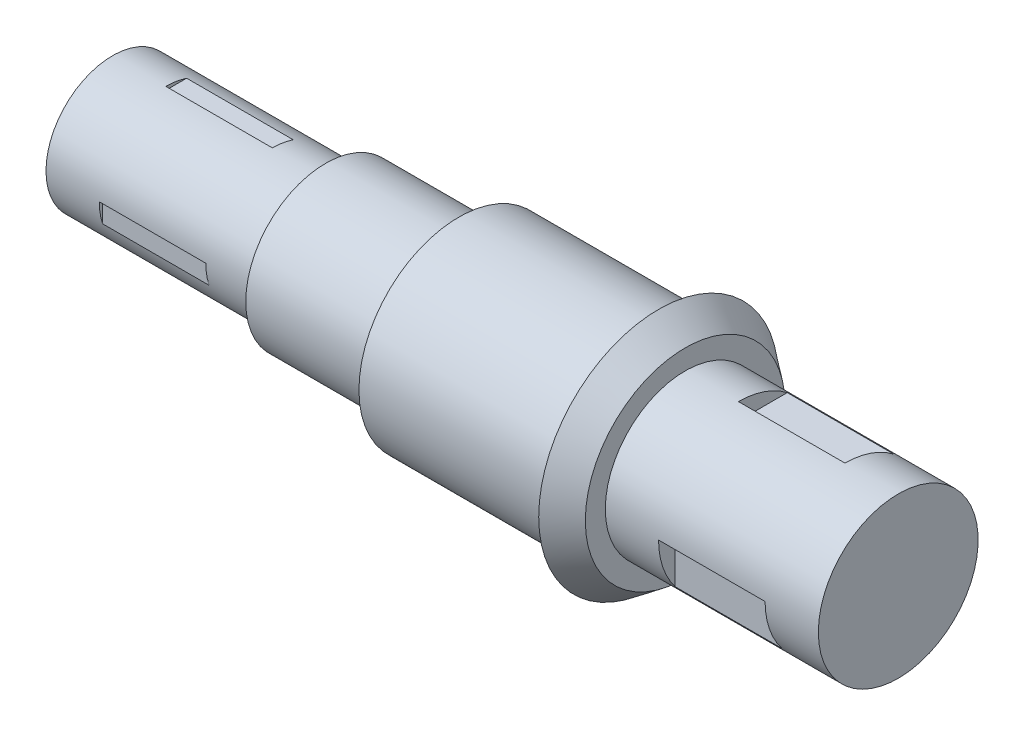
ISO-10303-21;
HEADER;
FILE_DESCRIPTION(('STEP AP214'),'2;1');
FILE_NAME('part.step','',(''),(''),'','','');
FILE_SCHEMA(('AUTOMOTIVE_DESIGN { 1 0 10303 214 1 1 1 1 }'));
ENDSEC;
DATA;
#1=APPLICATION_CONTEXT('core data for automotive mechanical design processes');
#2=APPLICATION_PROTOCOL_DEFINITION('international standard','automotive_design',2000,#1);
#3=PRODUCT_CONTEXT('',#1,'mechanical');
#4=PRODUCT('Part','Part','',(#3));
#5=PRODUCT_RELATED_PRODUCT_CATEGORY('part','',(#4));
#6=PRODUCT_DEFINITION_FORMATION('','',#4);
#7=PRODUCT_DEFINITION_CONTEXT('part definition',#1,'design');
#8=PRODUCT_DEFINITION('design','',#6,#7);
#9=PRODUCT_DEFINITION_SHAPE('','',#8);
#10=(LENGTH_UNIT() NAMED_UNIT(*) SI_UNIT(.MILLI.,.METRE.));
#11=(NAMED_UNIT(*) PLANE_ANGLE_UNIT() SI_UNIT($,.RADIAN.));
#12=(NAMED_UNIT(*) SI_UNIT($,.STERADIAN.) SOLID_ANGLE_UNIT());
#13=UNCERTAINTY_MEASURE_WITH_UNIT(LENGTH_MEASURE(1.E-05),#10,'distance_accuracy_value','');
#14=(GEOMETRIC_REPRESENTATION_CONTEXT(3) GLOBAL_UNCERTAINTY_ASSIGNED_CONTEXT((#13)) GLOBAL_UNIT_ASSIGNED_CONTEXT((#10,
#11,#12)) REPRESENTATION_CONTEXT('',''));
#15=CARTESIAN_POINT('',(0.,0.,0.));
#16=DIRECTION('',(0.,0.,1.));
#17=DIRECTION('',(1.,0.,0.));
#18=AXIS2_PLACEMENT_3D('',#15,#16,#17);
#19=CARTESIAN_POINT('',(0.,0.,0.));
#20=DIRECTION('',(1.,0.,0.));
#21=DIRECTION('',(0.,0.,-1.));
#22=AXIS2_PLACEMENT_3D('',#19,#20,#21);
#23=PLANE('',#22);
#24=CARTESIAN_POINT('',(0.,0.,0.));
#25=DIRECTION('',(-1.,0.,0.));
#26=DIRECTION('',(0.,0.,1.));
#27=AXIS2_PLACEMENT_3D('',#24,#25,#26);
#28=CIRCLE('',#27,5.);
#29=CARTESIAN_POINT('',(0.,0.,5.));
#30=VERTEX_POINT('',#29);
#31=EDGE_CURVE('E330',#30,#30,#28,.T.);
#32=ORIENTED_EDGE('',*,*,#31,.T.);
#33=EDGE_LOOP('',(#32));
#34=FACE_BOUND('',#33,.T.);
#35=ADVANCED_FACE('F33',(#34),#23,.F.);
#36=CARTESIAN_POINT('',(0.,0.,0.));
#37=DIRECTION('',(-1.,0.,0.));
#38=DIRECTION('',(0.,0.,1.));
#39=AXIS2_PLACEMENT_3D('',#36,#37,#38);
#40=CYLINDRICAL_SURFACE('',#39,5.);
#41=CARTESIAN_POINT('',(4.,0.,0.));
#42=DIRECTION('',(-1.,0.,0.));
#43=DIRECTION('',(0.,0.,1.));
#44=AXIS2_PLACEMENT_3D('',#41,#42,#43);
#45=CIRCLE('',#44,5.);
#46=CARTESIAN_POINT('',(4.,5.,0.));
#47=VERTEX_POINT('',#46);
#48=CARTESIAN_POINT('',(4.,4.75,-1.5612494995996));
#49=VERTEX_POINT('',#48);
#50=EDGE_CURVE('E373',#47,#49,#45,.T.);
#51=ORIENTED_EDGE('',*,*,#50,.T.);
#52=DIRECTION('',(-1.,0.,0.));
#53=VECTOR('',#52,1.);
#54=CARTESIAN_POINT('',(0.,4.75,-1.5612494995996));
#55=LINE('',#54,#53);
#56=CARTESIAN_POINT('',(12.,4.75,-1.5612494995996));
#57=VERTEX_POINT('',#56);
#58=EDGE_CURVE('E376',#49,#57,#55,.F.);
#59=ORIENTED_EDGE('',*,*,#58,.T.);
#60=CARTESIAN_POINT('',(12.,0.,0.));
#61=DIRECTION('',(1.,0.,0.));
#62=DIRECTION('',(0.,0.,-1.));
#63=AXIS2_PLACEMENT_3D('',#60,#61,#62);
#64=CIRCLE('',#63,5.);
#65=CARTESIAN_POINT('',(12.,5.,0.));
#66=VERTEX_POINT('',#65);
#67=EDGE_CURVE('E370',#57,#66,#64,.T.);
#68=ORIENTED_EDGE('',*,*,#67,.T.);
#69=DIRECTION('',(-1.,0.,0.));
#70=VECTOR('',#69,1.);
#71=CARTESIAN_POINT('',(0.,5.,0.));
#72=LINE('',#71,#70);
#73=EDGE_CURVE('E368',#47,#66,#72,.F.);
#74=ORIENTED_EDGE('',*,*,#73,.F.);
#75=EDGE_LOOP('',(#51,#59,#68,#74));
#76=FACE_BOUND('',#75,.T.);
#77=DIRECTION('',(-1.,0.,0.));
#78=VECTOR('',#77,1.);
#79=CARTESIAN_POINT('',(0.,-4.75,-1.5612494995996));
#80=LINE('',#79,#78);
#81=CARTESIAN_POINT('',(12.,-4.75,-1.5612494995996));
#82=VERTEX_POINT('',#81);
#83=CARTESIAN_POINT('',(4.,-4.75,-1.5612494995996));
#84=VERTEX_POINT('',#83);
#85=EDGE_CURVE('E362',#82,#84,#80,.T.);
#86=ORIENTED_EDGE('',*,*,#85,.T.);
#87=CARTESIAN_POINT('',(4.,0.,0.));
#88=DIRECTION('',(-1.,0.,0.));
#89=DIRECTION('',(0.,0.,1.));
#90=AXIS2_PLACEMENT_3D('',#87,#88,#89);
#91=CIRCLE('',#90,5.);
#92=CARTESIAN_POINT('',(4.,-5.,0.));
#93=VERTEX_POINT('',#92);
#94=EDGE_CURVE('E365',#84,#93,#91,.T.);
#95=ORIENTED_EDGE('',*,*,#94,.T.);
#96=DIRECTION('',(-1.,0.,0.));
#97=VECTOR('',#96,1.);
#98=CARTESIAN_POINT('',(0.,-5.,0.));
#99=LINE('',#98,#97);
#100=CARTESIAN_POINT('',(12.,-5.,0.));
#101=VERTEX_POINT('',#100);
#102=EDGE_CURVE('E356',#93,#101,#99,.F.);
#103=ORIENTED_EDGE('',*,*,#102,.T.);
#104=CARTESIAN_POINT('',(12.,0.,0.));
#105=DIRECTION('',(1.,0.,0.));
#106=DIRECTION('',(0.,0.,-1.));
#107=AXIS2_PLACEMENT_3D('',#104,#105,#106);
#108=CIRCLE('',#107,5.);
#109=EDGE_CURVE('E359',#101,#82,#108,.T.);
#110=ORIENTED_EDGE('',*,*,#109,.T.);
#111=EDGE_LOOP('',(#86,#95,#103,#110));
#112=FACE_BOUND('',#111,.T.);
#113=CARTESIAN_POINT('',(4.,0.,0.));
#114=DIRECTION('',(-1.,0.,0.));
#115=DIRECTION('',(0.,0.,1.));
#116=AXIS2_PLACEMENT_3D('',#113,#114,#115);
#117=CIRCLE('',#116,5.);
#118=CARTESIAN_POINT('',(4.,0.,-5.));
#119=VERTEX_POINT('',#118);
#120=CARTESIAN_POINT('',(4.,-1.5612494995996,-4.75));
#121=VERTEX_POINT('',#120);
#122=EDGE_CURVE('E350',#119,#121,#117,.T.);
#123=ORIENTED_EDGE('',*,*,#122,.T.);
#124=DIRECTION('',(-1.,0.,0.));
#125=VECTOR('',#124,1.);
#126=CARTESIAN_POINT('',(0.,-1.5612494995996,-4.75));
#127=LINE('',#126,#125);
#128=CARTESIAN_POINT('',(12.,-1.5612494995996,-4.75));
#129=VERTEX_POINT('',#128);
#130=EDGE_CURVE('E353',#121,#129,#127,.F.);
#131=ORIENTED_EDGE('',*,*,#130,.T.);
#132=CARTESIAN_POINT('',(12.,0.,0.));
#133=DIRECTION('',(1.,0.,0.));
#134=DIRECTION('',(0.,0.,-1.));
#135=AXIS2_PLACEMENT_3D('',#132,#133,#134);
#136=CIRCLE('',#135,5.);
#137=CARTESIAN_POINT('',(12.,0.,-5.));
#138=VERTEX_POINT('',#137);
#139=EDGE_CURVE('E347',#129,#138,#136,.T.);
#140=ORIENTED_EDGE('',*,*,#139,.T.);
#141=DIRECTION('',(-1.,0.,0.));
#142=VECTOR('',#141,1.);
#143=CARTESIAN_POINT('',(0.,0.,-5.));
#144=LINE('',#143,#142);
#145=EDGE_CURVE('E345',#119,#138,#144,.F.);
#146=ORIENTED_EDGE('',*,*,#145,.F.);
#147=EDGE_LOOP('',(#123,#131,#140,#146));
#148=FACE_BOUND('',#147,.T.);
#149=DIRECTION('',(-1.,0.,0.));
#150=VECTOR('',#149,1.);
#151=CARTESIAN_POINT('',(0.,-1.5612494995996,4.75));
#152=LINE('',#151,#150);
#153=CARTESIAN_POINT('',(12.,-1.5612494995996,4.75));
#154=VERTEX_POINT('',#153);
#155=CARTESIAN_POINT('',(4.,-1.5612494995996,4.75));
#156=VERTEX_POINT('',#155);
#157=EDGE_CURVE('E339',#154,#156,#152,.T.);
#158=ORIENTED_EDGE('',*,*,#157,.T.);
#159=CARTESIAN_POINT('',(4.,0.,0.));
#160=DIRECTION('',(-1.,0.,0.));
#161=DIRECTION('',(0.,0.,1.));
#162=AXIS2_PLACEMENT_3D('',#159,#160,#161);
#163=CIRCLE('',#162,5.);
#164=CARTESIAN_POINT('',(4.,0.,5.));
#165=VERTEX_POINT('',#164);
#166=EDGE_CURVE('E342',#156,#165,#163,.T.);
#167=ORIENTED_EDGE('',*,*,#166,.T.);
#168=DIRECTION('',(-1.,0.,0.));
#169=VECTOR('',#168,1.);
#170=CARTESIAN_POINT('',(0.,0.,5.));
#171=LINE('',#170,#169);
#172=CARTESIAN_POINT('',(12.,0.,5.));
#173=VERTEX_POINT('',#172);
#174=EDGE_CURVE('E333',#165,#173,#171,.F.);
#175=ORIENTED_EDGE('',*,*,#174,.T.);
#176=CARTESIAN_POINT('',(12.,0.,0.));
#177=DIRECTION('',(1.,0.,0.));
#178=DIRECTION('',(0.,0.,-1.));
#179=AXIS2_PLACEMENT_3D('',#176,#177,#178);
#180=CIRCLE('',#179,5.);
#181=EDGE_CURVE('E336',#173,#154,#180,.T.);
#182=ORIENTED_EDGE('',*,*,#181,.T.);
#183=EDGE_LOOP('',(#158,#167,#175,#182));
#184=FACE_BOUND('',#183,.T.);
#185=ORIENTED_EDGE('',*,*,#31,.F.);
#186=EDGE_LOOP('',(#185));
#187=FACE_BOUND('',#186,.T.);
#188=CARTESIAN_POINT('',(16.,0.,0.));
#189=DIRECTION('',(-1.,0.,0.));
#190=DIRECTION('',(0.,0.,1.));
#191=AXIS2_PLACEMENT_3D('',#188,#189,#190);
#192=CIRCLE('',#191,5.);
#193=CARTESIAN_POINT('',(16.,0.,5.));
#194=VERTEX_POINT('',#193);
#195=EDGE_CURVE('E327',#194,#194,#192,.T.);
#196=ORIENTED_EDGE('',*,*,#195,.T.);
#197=EDGE_LOOP('',(#196));
#198=FACE_BOUND('',#197,.T.);
#199=ADVANCED_FACE('F434',(#76,#112,#148,#184,#187,#198),#40,.T.);
#200=CARTESIAN_POINT('',(16.,5.,0.));
#201=DIRECTION('',(1.,0.,0.));
#202=DIRECTION('',(0.,0.,-1.));
#203=AXIS2_PLACEMENT_3D('',#200,#201,#202);
#204=PLANE('',#203);
#205=ORIENTED_EDGE('',*,*,#195,.F.);
#206=EDGE_LOOP('',(#205));
#207=FACE_BOUND('',#206,.T.);
#208=CARTESIAN_POINT('',(16.,0.,0.));
#209=DIRECTION('',(-1.,0.,0.));
#210=DIRECTION('',(0.,0.,1.));
#211=AXIS2_PLACEMENT_3D('',#208,#209,#210);
#212=CIRCLE('',#211,6.);
#213=CARTESIAN_POINT('',(16.,0.,6.));
#214=VERTEX_POINT('',#213);
#215=EDGE_CURVE('E324',#214,#214,#212,.T.);
#216=ORIENTED_EDGE('',*,*,#215,.T.);
#217=EDGE_LOOP('',(#216));
#218=FACE_BOUND('',#217,.T.);
#219=ADVANCED_FACE('F439',(#207,#218),#204,.F.);
#220=CARTESIAN_POINT('',(0.,0.,0.));
#221=DIRECTION('',(-1.,0.,0.));
#222=DIRECTION('',(0.,0.,1.));
#223=AXIS2_PLACEMENT_3D('',#220,#221,#222);
#224=CYLINDRICAL_SURFACE('',#223,6.);
#225=ORIENTED_EDGE('',*,*,#215,.F.);
#226=EDGE_LOOP('',(#225));
#227=FACE_BOUND('',#226,.T.);
#228=CARTESIAN_POINT('',(26.,0.,0.));
#229=DIRECTION('',(-1.,0.,0.));
#230=DIRECTION('',(0.,0.,1.));
#231=AXIS2_PLACEMENT_3D('',#228,#229,#230);
#232=CIRCLE('',#231,6.);
#233=CARTESIAN_POINT('',(26.,0.,6.));
#234=VERTEX_POINT('',#233);
#235=EDGE_CURVE('E321',#234,#234,#232,.T.);
#236=ORIENTED_EDGE('',*,*,#235,.T.);
#237=EDGE_LOOP('',(#236));
#238=FACE_BOUND('',#237,.T.);
#239=ADVANCED_FACE('F448',(#227,#238),#224,.T.);
#240=CARTESIAN_POINT('',(26.,6.,0.));
#241=DIRECTION('',(1.,0.,0.));
#242=DIRECTION('',(0.,0.,-1.));
#243=AXIS2_PLACEMENT_3D('',#240,#241,#242);
#244=PLANE('',#243);
#245=ORIENTED_EDGE('',*,*,#235,.F.);
#246=EDGE_LOOP('',(#245));
#247=FACE_BOUND('',#246,.T.);
#248=CARTESIAN_POINT('',(26.,0.,0.));
#249=DIRECTION('',(-1.,0.,0.));
#250=DIRECTION('',(0.,0.,1.));
#251=AXIS2_PLACEMENT_3D('',#248,#249,#250);
#252=CIRCLE('',#251,7.5);
#253=CARTESIAN_POINT('',(26.,0.,7.5));
#254=VERTEX_POINT('',#253);
#255=EDGE_CURVE('E318',#254,#254,#252,.T.);
#256=ORIENTED_EDGE('',*,*,#255,.T.);
#257=EDGE_LOOP('',(#256));
#258=FACE_BOUND('',#257,.T.);
#259=ADVANCED_FACE('F454',(#247,#258),#244,.F.);
#260=CARTESIAN_POINT('',(0.,0.,0.));
#261=DIRECTION('',(-1.,0.,0.));
#262=DIRECTION('',(0.,0.,1.));
#263=AXIS2_PLACEMENT_3D('',#260,#261,#262);
#264=CYLINDRICAL_SURFACE('',#263,7.5);
#265=ORIENTED_EDGE('',*,*,#255,.F.);
#266=EDGE_LOOP('',(#265));
#267=FACE_BOUND('',#266,.T.);
#268=CARTESIAN_POINT('',(41.,0.,0.));
#269=DIRECTION('',(-1.,0.,0.));
#270=DIRECTION('',(0.,0.,1.));
#271=AXIS2_PLACEMENT_3D('',#268,#269,#270);
#272=CIRCLE('',#271,7.5);
#273=CARTESIAN_POINT('',(41.,0.,7.5));
#274=VERTEX_POINT('',#273);
#275=EDGE_CURVE('E315',#274,#274,#272,.T.);
#276=ORIENTED_EDGE('',*,*,#275,.T.);
#277=EDGE_LOOP('',(#276));
#278=FACE_BOUND('',#277,.T.);
#279=ADVANCED_FACE('F460',(#267,#278),#264,.T.);
#280=CARTESIAN_POINT('',(41.,7.5,0.));
#281=DIRECTION('',(1.,0.,0.));
#282=DIRECTION('',(0.,0.,-1.));
#283=AXIS2_PLACEMENT_3D('',#280,#281,#282);
#284=PLANE('',#283);
#285=ORIENTED_EDGE('',*,*,#275,.F.);
#286=EDGE_LOOP('',(#285));
#287=FACE_BOUND('',#286,.T.);
#288=CARTESIAN_POINT('',(41.,0.,0.));
#289=DIRECTION('',(-1.,0.,0.));
#290=DIRECTION('',(0.,0.,1.));
#291=AXIS2_PLACEMENT_3D('',#288,#289,#290);
#292=CIRCLE('',#291,9.);
#293=CARTESIAN_POINT('',(41.,0.,9.));
#294=VERTEX_POINT('',#293);
#295=EDGE_CURVE('E312',#294,#294,#292,.T.);
#296=ORIENTED_EDGE('',*,*,#295,.T.);
#297=EDGE_LOOP('',(#296));
#298=FACE_BOUND('',#297,.T.);
#299=ADVANCED_FACE('F466',(#287,#298),#284,.F.);
#300=CARTESIAN_POINT('',(43.,0.,0.));
#301=DIRECTION('',(-1.,0.,0.));
#302=DIRECTION('',(0.,0.,1.));
#303=AXIS2_PLACEMENT_3D('',#300,#301,#302);
#304=CONICAL_SURFACE('',#303,7.5,0.643501108793285);
#305=ORIENTED_EDGE('',*,*,#295,.F.);
#306=EDGE_LOOP('',(#305));
#307=FACE_BOUND('',#306,.T.);
#308=CARTESIAN_POINT('',(43.,0.,0.));
#309=DIRECTION('',(-1.,0.,0.));
#310=DIRECTION('',(0.,0.,1.));
#311=AXIS2_PLACEMENT_3D('',#308,#309,#310);
#312=CIRCLE('',#311,7.5);
#313=CARTESIAN_POINT('',(43.,0.,7.5));
#314=VERTEX_POINT('',#313);
#315=EDGE_CURVE('E309',#314,#314,#312,.T.);
#316=ORIENTED_EDGE('',*,*,#315,.T.);
#317=EDGE_LOOP('',(#316));
#318=FACE_BOUND('',#317,.T.);
#319=ADVANCED_FACE('F472',(#307,#318),#304,.T.);
#320=CARTESIAN_POINT('',(43.,7.5,0.));
#321=DIRECTION('',(-1.,0.,0.));
#322=DIRECTION('',(0.,0.,1.));
#323=AXIS2_PLACEMENT_3D('',#320,#321,#322);
#324=PLANE('',#323);
#325=ORIENTED_EDGE('',*,*,#315,.F.);
#326=EDGE_LOOP('',(#325));
#327=FACE_BOUND('',#326,.T.);
#328=CARTESIAN_POINT('',(43.,0.,0.));
#329=DIRECTION('',(-1.,0.,0.));
#330=DIRECTION('',(0.,0.,1.));
#331=AXIS2_PLACEMENT_3D('',#328,#329,#330);
#332=CIRCLE('',#331,6.);
#333=CARTESIAN_POINT('',(43.,0.,6.));
#334=VERTEX_POINT('',#333);
#335=EDGE_CURVE('E306',#334,#334,#332,.T.);
#336=ORIENTED_EDGE('',*,*,#335,.T.);
#337=EDGE_LOOP('',(#336));
#338=FACE_BOUND('',#337,.T.);
#339=ADVANCED_FACE('F478',(#327,#338),#324,.F.);
#340=CARTESIAN_POINT('',(0.,0.,0.));
#341=DIRECTION('',(-1.,0.,0.));
#342=DIRECTION('',(0.,0.,1.));
#343=AXIS2_PLACEMENT_3D('',#340,#341,#342);
#344=CYLINDRICAL_SURFACE('',#343,6.);
#345=CARTESIAN_POINT('',(47.,0.,0.));
#346=DIRECTION('',(-1.,0.,0.));
#347=DIRECTION('',(0.,0.,1.));
#348=AXIS2_PLACEMENT_3D('',#345,#346,#347);
#349=CIRCLE('',#348,6.);
#350=CARTESIAN_POINT('',(47.,6.,0.));
#351=VERTEX_POINT('',#350);
#352=CARTESIAN_POINT('',(47.,4.75,-3.66571957465379));
#353=VERTEX_POINT('',#352);
#354=EDGE_CURVE('E40',#351,#353,#349,.T.);
#355=ORIENTED_EDGE('',*,*,#354,.T.);
#356=DIRECTION('',(-1.,0.,0.));
#357=VECTOR('',#356,1.);
#358=CARTESIAN_POINT('',(0.,4.75,-3.66571957465379));
#359=LINE('',#358,#357);
#360=CARTESIAN_POINT('',(55.,4.75,-3.66571957465379));
#361=VERTEX_POINT('',#360);
#362=EDGE_CURVE('E11',#353,#361,#359,.F.);
#363=ORIENTED_EDGE('',*,*,#362,.T.);
#364=CARTESIAN_POINT('',(55.,0.,0.));
#365=DIRECTION('',(1.,0.,0.));
#366=DIRECTION('',(0.,0.,-1.));
#367=AXIS2_PLACEMENT_3D('',#364,#365,#366);
#368=CIRCLE('',#367,6.);
#369=CARTESIAN_POINT('',(55.,6.,0.));
#370=VERTEX_POINT('',#369);
#371=EDGE_CURVE('E416',#361,#370,#368,.T.);
#372=ORIENTED_EDGE('',*,*,#371,.T.);
#373=DIRECTION('',(-1.,0.,0.));
#374=VECTOR('',#373,1.);
#375=CARTESIAN_POINT('',(0.,6.,0.));
#376=LINE('',#375,#374);
#377=EDGE_CURVE('E414',#351,#370,#376,.F.);
#378=ORIENTED_EDGE('',*,*,#377,.F.);
#379=EDGE_LOOP('',(#355,#363,#372,#378));
#380=FACE_BOUND('',#379,.T.);
#381=DIRECTION('',(-1.,0.,0.));
#382=VECTOR('',#381,1.);
#383=CARTESIAN_POINT('',(0.,-4.75,-3.66571957465379));
#384=LINE('',#383,#382);
#385=CARTESIAN_POINT('',(55.,-4.75,-3.66571957465379));
#386=VERTEX_POINT('',#385);
#387=CARTESIAN_POINT('',(47.,-4.75,-3.66571957465379));
#388=VERTEX_POINT('',#387);
#389=EDGE_CURVE('E408',#386,#388,#384,.T.);
#390=ORIENTED_EDGE('',*,*,#389,.T.);
#391=CARTESIAN_POINT('',(47.,0.,0.));
#392=DIRECTION('',(-1.,0.,0.));
#393=DIRECTION('',(0.,0.,1.));
#394=AXIS2_PLACEMENT_3D('',#391,#392,#393);
#395=CIRCLE('',#394,6.);
#396=CARTESIAN_POINT('',(47.,-6.,0.));
#397=VERTEX_POINT('',#396);
#398=EDGE_CURVE('E411',#388,#397,#395,.T.);
#399=ORIENTED_EDGE('',*,*,#398,.T.);
#400=DIRECTION('',(-1.,0.,0.));
#401=VECTOR('',#400,1.);
#402=CARTESIAN_POINT('',(0.,-6.,0.));
#403=LINE('',#402,#401);
#404=CARTESIAN_POINT('',(55.,-6.,0.));
#405=VERTEX_POINT('',#404);
#406=EDGE_CURVE('E402',#397,#405,#403,.F.);
#407=ORIENTED_EDGE('',*,*,#406,.T.);
#408=CARTESIAN_POINT('',(55.,0.,0.));
#409=DIRECTION('',(1.,0.,0.));
#410=DIRECTION('',(0.,0.,-1.));
#411=AXIS2_PLACEMENT_3D('',#408,#409,#410);
#412=CIRCLE('',#411,6.);
#413=EDGE_CURVE('E405',#405,#386,#412,.T.);
#414=ORIENTED_EDGE('',*,*,#413,.T.);
#415=EDGE_LOOP('',(#390,#399,#407,#414));
#416=FACE_BOUND('',#415,.T.);
#417=CARTESIAN_POINT('',(47.,0.,0.));
#418=DIRECTION('',(-1.,0.,0.));
#419=DIRECTION('',(0.,0.,1.));
#420=AXIS2_PLACEMENT_3D('',#417,#418,#419);
#421=CIRCLE('',#420,6.);
#422=CARTESIAN_POINT('',(47.,0.,-6.));
#423=VERTEX_POINT('',#422);
#424=CARTESIAN_POINT('',(47.,-3.66571957465379,-4.75));
#425=VERTEX_POINT('',#424);
#426=EDGE_CURVE('E396',#423,#425,#421,.T.);
#427=ORIENTED_EDGE('',*,*,#426,.T.);
#428=DIRECTION('',(-1.,0.,0.));
#429=VECTOR('',#428,1.);
#430=CARTESIAN_POINT('',(0.,-3.66571957465379,-4.75));
#431=LINE('',#430,#429);
#432=CARTESIAN_POINT('',(55.,-3.66571957465379,-4.75));
#433=VERTEX_POINT('',#432);
#434=EDGE_CURVE('E399',#425,#433,#431,.F.);
#435=ORIENTED_EDGE('',*,*,#434,.T.);
#436=CARTESIAN_POINT('',(55.,0.,0.));
#437=DIRECTION('',(1.,0.,0.));
#438=DIRECTION('',(0.,0.,-1.));
#439=AXIS2_PLACEMENT_3D('',#436,#437,#438);
#440=CIRCLE('',#439,6.);
#441=CARTESIAN_POINT('',(55.,0.,-6.));
#442=VERTEX_POINT('',#441);
#443=EDGE_CURVE('E393',#433,#442,#440,.T.);
#444=ORIENTED_EDGE('',*,*,#443,.T.);
#445=DIRECTION('',(-1.,0.,0.));
#446=VECTOR('',#445,1.);
#447=CARTESIAN_POINT('',(0.,0.,-6.));
#448=LINE('',#447,#446);
#449=EDGE_CURVE('E391',#423,#442,#448,.F.);
#450=ORIENTED_EDGE('',*,*,#449,.F.);
#451=EDGE_LOOP('',(#427,#435,#444,#450));
#452=FACE_BOUND('',#451,.T.);
#453=DIRECTION('',(-1.,0.,0.));
#454=VECTOR('',#453,1.);
#455=CARTESIAN_POINT('',(0.,-3.66571957465379,4.75));
#456=LINE('',#455,#454);
#457=CARTESIAN_POINT('',(55.,-3.66571957465379,4.75));
#458=VERTEX_POINT('',#457);
#459=CARTESIAN_POINT('',(47.,-3.66571957465379,4.75));
#460=VERTEX_POINT('',#459);
#461=EDGE_CURVE('E385',#458,#460,#456,.T.);
#462=ORIENTED_EDGE('',*,*,#461,.T.);
#463=CARTESIAN_POINT('',(47.,0.,0.));
#464=DIRECTION('',(-1.,0.,0.));
#465=DIRECTION('',(0.,0.,1.));
#466=AXIS2_PLACEMENT_3D('',#463,#464,#465);
#467=CIRCLE('',#466,6.);
#468=CARTESIAN_POINT('',(47.,0.,6.));
#469=VERTEX_POINT('',#468);
#470=EDGE_CURVE('E388',#460,#469,#467,.T.);
#471=ORIENTED_EDGE('',*,*,#470,.T.);
#472=DIRECTION('',(-1.,0.,0.));
#473=VECTOR('',#472,1.);
#474=CARTESIAN_POINT('',(0.,0.,6.));
#475=LINE('',#474,#473);
#476=CARTESIAN_POINT('',(55.,0.,6.));
#477=VERTEX_POINT('',#476);
#478=EDGE_CURVE('E379',#469,#477,#475,.F.);
#479=ORIENTED_EDGE('',*,*,#478,.T.);
#480=CARTESIAN_POINT('',(55.,0.,0.));
#481=DIRECTION('',(1.,0.,0.));
#482=DIRECTION('',(0.,0.,-1.));
#483=AXIS2_PLACEMENT_3D('',#480,#481,#482);
#484=CIRCLE('',#483,6.);
#485=EDGE_CURVE('E382',#477,#458,#484,.T.);
#486=ORIENTED_EDGE('',*,*,#485,.T.);
#487=EDGE_LOOP('',(#462,#471,#479,#486));
#488=FACE_BOUND('',#487,.T.);
#489=ORIENTED_EDGE('',*,*,#335,.F.);
#490=EDGE_LOOP('',(#489));
#491=FACE_BOUND('',#490,.T.);
#492=CARTESIAN_POINT('',(59.,0.,0.));
#493=DIRECTION('',(-1.,0.,0.));
#494=DIRECTION('',(0.,0.,1.));
#495=AXIS2_PLACEMENT_3D('',#492,#493,#494);
#496=CIRCLE('',#495,6.);
#497=CARTESIAN_POINT('',(59.,0.,6.));
#498=VERTEX_POINT('',#497);
#499=EDGE_CURVE('E291',#498,#498,#496,.T.);
#500=ORIENTED_EDGE('',*,*,#499,.T.);
#501=EDGE_LOOP('',(#500));
#502=FACE_BOUND('',#501,.T.);
#503=ADVANCED_FACE('F419',(#380,#416,#452,#488,#491,#502),#344,.T.);
#504=CARTESIAN_POINT('',(59.,6.,0.));
#505=DIRECTION('',(-1.,0.,0.));
#506=DIRECTION('',(0.,0.,1.));
#507=AXIS2_PLACEMENT_3D('',#504,#505,#506);
#508=PLANE('',#507);
#509=ORIENTED_EDGE('',*,*,#499,.F.);
#510=EDGE_LOOP('',(#509));
#511=FACE_BOUND('',#510,.T.);
#512=ADVANCED_FACE('F489',(#511),#508,.F.);
#513=CARTESIAN_POINT('',(4.,-30.,4.75));
#514=DIRECTION('',(-1.,0.,0.));
#515=DIRECTION('',(0.,0.,1.));
#516=AXIS2_PLACEMENT_3D('',#513,#514,#515);
#517=PLANE('',#516);
#518=DIRECTION('',(0.,1.,0.));
#519=VECTOR('',#518,1.);
#520=CARTESIAN_POINT('',(4.,-30.,4.75));
#521=LINE('',#520,#519);
#522=CARTESIAN_POINT('',(4.,0.,4.75));
#523=VERTEX_POINT('',#522);
#524=EDGE_CURVE('E282',#156,#523,#521,.T.);
#525=ORIENTED_EDGE('',*,*,#524,.T.);
#526=DIRECTION('',(0.,0.,1.));
#527=VECTOR('',#526,1.);
#528=CARTESIAN_POINT('',(4.,0.,4.75));
#529=LINE('',#528,#527);
#530=EDGE_CURVE('E265',#523,#165,#529,.T.);
#531=ORIENTED_EDGE('',*,*,#530,.T.);
#532=ORIENTED_EDGE('',*,*,#166,.F.);
#533=EDGE_LOOP('',(#525,#531,#532));
#534=FACE_BOUND('',#533,.T.);
#535=ADVANCED_FACE('F494',(#534),#517,.F.);
#536=CARTESIAN_POINT('',(4.,-30.,4.75));
#537=DIRECTION('',(0.,0.,-1.));
#538=DIRECTION('',(-1.,0.,0.));
#539=AXIS2_PLACEMENT_3D('',#536,#537,#538);
#540=PLANE('',#539);
#541=DIRECTION('',(0.,1.,0.));
#542=VECTOR('',#541,1.);
#543=CARTESIAN_POINT('',(12.,-30.,4.75));
#544=LINE('',#543,#542);
#545=CARTESIAN_POINT('',(12.,0.,4.75));
#546=VERTEX_POINT('',#545);
#547=EDGE_CURVE('E301',#154,#546,#544,.T.);
#548=ORIENTED_EDGE('',*,*,#547,.T.);
#549=DIRECTION('',(-1.,0.,0.));
#550=VECTOR('',#549,1.);
#551=CARTESIAN_POINT('',(4.,0.,4.75));
#552=LINE('',#551,#550);
#553=EDGE_CURVE('E298',#546,#523,#552,.T.);
#554=ORIENTED_EDGE('',*,*,#553,.T.);
#555=ORIENTED_EDGE('',*,*,#524,.F.);
#556=ORIENTED_EDGE('',*,*,#157,.F.);
#557=EDGE_LOOP('',(#548,#554,#555,#556));
#558=FACE_BOUND('',#557,.T.);
#559=ADVANCED_FACE('F499',(#558),#540,.F.);
#560=CARTESIAN_POINT('',(12.,-30.,4.75));
#561=DIRECTION('',(1.,0.,0.));
#562=DIRECTION('',(0.,0.,-1.));
#563=AXIS2_PLACEMENT_3D('',#560,#561,#562);
#564=PLANE('',#563);
#565=DIRECTION('',(0.,0.,-1.));
#566=VECTOR('',#565,1.);
#567=CARTESIAN_POINT('',(12.,0.,4.75));
#568=LINE('',#567,#566);
#569=EDGE_CURVE('E295',#173,#546,#568,.T.);
#570=ORIENTED_EDGE('',*,*,#569,.T.);
#571=ORIENTED_EDGE('',*,*,#547,.F.);
#572=ORIENTED_EDGE('',*,*,#181,.F.);
#573=EDGE_LOOP('',(#570,#571,#572));
#574=FACE_BOUND('',#573,.T.);
#575=ADVANCED_FACE('F503',(#574),#564,.F.);
#576=CARTESIAN_POINT('',(0.,0.,0.));
#577=DIRECTION('',(0.,1.,0.));
#578=DIRECTION('',(0.,0.,1.));
#579=AXIS2_PLACEMENT_3D('',#576,#577,#578);
#580=PLANE('',#579);
#581=ORIENTED_EDGE('',*,*,#530,.F.);
#582=ORIENTED_EDGE('',*,*,#553,.F.);
#583=ORIENTED_EDGE('',*,*,#569,.F.);
#584=ORIENTED_EDGE('',*,*,#174,.F.);
#585=EDGE_LOOP('',(#581,#582,#583,#584));
#586=FACE_BOUND('',#585,.T.);
#587=ADVANCED_FACE('F506',(#586),#580,.F.);
#588=CARTESIAN_POINT('',(4.,-30.,-4.75));
#589=DIRECTION('',(-1.,0.,0.));
#590=DIRECTION('',(0.,0.,1.));
#591=AXIS2_PLACEMENT_3D('',#588,#589,#590);
#592=PLANE('',#591);
#593=DIRECTION('',(0.,0.,1.));
#594=VECTOR('',#593,1.);
#595=CARTESIAN_POINT('',(4.,0.,-4.75));
#596=LINE('',#595,#594);
#597=CARTESIAN_POINT('',(4.,0.,-4.75));
#598=VERTEX_POINT('',#597);
#599=EDGE_CURVE('E278',#119,#598,#596,.T.);
#600=ORIENTED_EDGE('',*,*,#599,.T.);
#601=DIRECTION('',(0.,1.,0.));
#602=VECTOR('',#601,1.);
#603=CARTESIAN_POINT('',(4.,-30.,-4.75));
#604=LINE('',#603,#602);
#605=EDGE_CURVE('E288',#121,#598,#604,.T.);
#606=ORIENTED_EDGE('',*,*,#605,.F.);
#607=ORIENTED_EDGE('',*,*,#122,.F.);
#608=EDGE_LOOP('',(#600,#606,#607));
#609=FACE_BOUND('',#608,.T.);
#610=ADVANCED_FACE('F513',(#609),#592,.F.);
#611=CARTESIAN_POINT('',(12.,-30.,-4.75));
#612=DIRECTION('',(1.,0.,0.));
#613=DIRECTION('',(0.,0.,-1.));
#614=AXIS2_PLACEMENT_3D('',#611,#612,#613);
#615=PLANE('',#614);
#616=DIRECTION('',(0.,1.,0.));
#617=VECTOR('',#616,1.);
#618=CARTESIAN_POINT('',(12.,-30.,-4.75));
#619=LINE('',#618,#617);
#620=CARTESIAN_POINT('',(12.,0.,-4.75));
#621=VERTEX_POINT('',#620);
#622=EDGE_CURVE('E289',#129,#621,#619,.T.);
#623=ORIENTED_EDGE('',*,*,#622,.T.);
#624=DIRECTION('',(0.,0.,-1.));
#625=VECTOR('',#624,1.);
#626=CARTESIAN_POINT('',(12.,0.,-4.75));
#627=LINE('',#626,#625);
#628=EDGE_CURVE('E285',#621,#138,#627,.T.);
#629=ORIENTED_EDGE('',*,*,#628,.T.);
#630=ORIENTED_EDGE('',*,*,#139,.F.);
#631=EDGE_LOOP('',(#623,#629,#630));
#632=FACE_BOUND('',#631,.T.);
#633=ADVANCED_FACE('F517',(#632),#615,.F.);
#634=CARTESIAN_POINT('',(4.,-30.,-4.75));
#635=DIRECTION('',(0.,0.,1.));
#636=DIRECTION('',(1.,0.,0.));
#637=AXIS2_PLACEMENT_3D('',#634,#635,#636);
#638=PLANE('',#637);
#639=ORIENTED_EDGE('',*,*,#605,.T.);
#640=DIRECTION('',(1.,0.,0.));
#641=VECTOR('',#640,1.);
#642=CARTESIAN_POINT('',(4.,0.,-4.75));
#643=LINE('',#642,#641);
#644=EDGE_CURVE('E281',#598,#621,#643,.T.);
#645=ORIENTED_EDGE('',*,*,#644,.T.);
#646=ORIENTED_EDGE('',*,*,#622,.F.);
#647=ORIENTED_EDGE('',*,*,#130,.F.);
#648=EDGE_LOOP('',(#639,#645,#646,#647));
#649=FACE_BOUND('',#648,.T.);
#650=ADVANCED_FACE('F519',(#649),#638,.F.);
#651=CARTESIAN_POINT('',(0.,0.,0.));
#652=DIRECTION('',(0.,-1.,0.));
#653=DIRECTION('',(0.,0.,-1.));
#654=AXIS2_PLACEMENT_3D('',#651,#652,#653);
#655=PLANE('',#654);
#656=ORIENTED_EDGE('',*,*,#145,.T.);
#657=ORIENTED_EDGE('',*,*,#628,.F.);
#658=ORIENTED_EDGE('',*,*,#644,.F.);
#659=ORIENTED_EDGE('',*,*,#599,.F.);
#660=EDGE_LOOP('',(#656,#657,#658,#659));
#661=FACE_BOUND('',#660,.T.);
#662=ADVANCED_FACE('F522',(#661),#655,.T.);
#663=CARTESIAN_POINT('',(4.,-4.75,-30.));
#664=DIRECTION('',(-1.,0.,0.));
#665=DIRECTION('',(0.,0.,1.));
#666=AXIS2_PLACEMENT_3D('',#663,#664,#665);
#667=PLANE('',#666);
#668=DIRECTION('',(0.,0.,1.));
#669=VECTOR('',#668,1.);
#670=CARTESIAN_POINT('',(4.,-4.75,-30.));
#671=LINE('',#670,#669);
#672=CARTESIAN_POINT('',(4.,-4.75,0.));
#673=VERTEX_POINT('',#672);
#674=EDGE_CURVE('E256',#84,#673,#671,.T.);
#675=ORIENTED_EDGE('',*,*,#674,.T.);
#676=DIRECTION('',(0.,-1.,0.));
#677=VECTOR('',#676,1.);
#678=CARTESIAN_POINT('',(4.,-4.75,0.));
#679=LINE('',#678,#677);
#680=EDGE_CURVE('E239',#673,#93,#679,.T.);
#681=ORIENTED_EDGE('',*,*,#680,.T.);
#682=ORIENTED_EDGE('',*,*,#94,.F.);
#683=EDGE_LOOP('',(#675,#681,#682));
#684=FACE_BOUND('',#683,.T.);
#685=ADVANCED_FACE('F529',(#684),#667,.F.);
#686=CARTESIAN_POINT('',(4.,-4.75,-30.));
#687=DIRECTION('',(0.,1.,0.));
#688=DIRECTION('',(0.,0.,1.));
#689=AXIS2_PLACEMENT_3D('',#686,#687,#688);
#690=PLANE('',#689);
#691=DIRECTION('',(0.,0.,1.));
#692=VECTOR('',#691,1.);
#693=CARTESIAN_POINT('',(12.,-4.75,-30.));
#694=LINE('',#693,#692);
#695=CARTESIAN_POINT('',(12.,-4.75,0.));
#696=VERTEX_POINT('',#695);
#697=EDGE_CURVE('E275',#82,#696,#694,.T.);
#698=ORIENTED_EDGE('',*,*,#697,.T.);
#699=DIRECTION('',(-1.,0.,0.));
#700=VECTOR('',#699,1.);
#701=CARTESIAN_POINT('',(4.,-4.75,0.));
#702=LINE('',#701,#700);
#703=EDGE_CURVE('E272',#696,#673,#702,.T.);
#704=ORIENTED_EDGE('',*,*,#703,.T.);
#705=ORIENTED_EDGE('',*,*,#674,.F.);
#706=ORIENTED_EDGE('',*,*,#85,.F.);
#707=EDGE_LOOP('',(#698,#704,#705,#706));
#708=FACE_BOUND('',#707,.T.);
#709=ADVANCED_FACE('F533',(#708),#690,.F.);
#710=CARTESIAN_POINT('',(12.,-4.75,-30.));
#711=DIRECTION('',(1.,0.,0.));
#712=DIRECTION('',(0.,0.,-1.));
#713=AXIS2_PLACEMENT_3D('',#710,#711,#712);
#714=PLANE('',#713);
#715=DIRECTION('',(0.,1.,0.));
#716=VECTOR('',#715,1.);
#717=CARTESIAN_POINT('',(12.,-4.75,0.));
#718=LINE('',#717,#716);
#719=EDGE_CURVE('E269',#101,#696,#718,.T.);
#720=ORIENTED_EDGE('',*,*,#719,.T.);
#721=ORIENTED_EDGE('',*,*,#697,.F.);
#722=ORIENTED_EDGE('',*,*,#109,.F.);
#723=EDGE_LOOP('',(#720,#721,#722));
#724=FACE_BOUND('',#723,.T.);
#725=ADVANCED_FACE('F535',(#724),#714,.F.);
#726=CARTESIAN_POINT('',(0.,0.,0.));
#727=DIRECTION('',(0.,0.,1.));
#728=DIRECTION('',(1.,0.,0.));
#729=AXIS2_PLACEMENT_3D('',#726,#727,#728);
#730=PLANE('',#729);
#731=ORIENTED_EDGE('',*,*,#680,.F.);
#732=ORIENTED_EDGE('',*,*,#703,.F.);
#733=ORIENTED_EDGE('',*,*,#719,.F.);
#734=ORIENTED_EDGE('',*,*,#102,.F.);
#735=EDGE_LOOP('',(#731,#732,#733,#734));
#736=FACE_BOUND('',#735,.T.);
#737=ADVANCED_FACE('F538',(#736),#730,.F.);
#738=CARTESIAN_POINT('',(4.,4.75,-30.));
#739=DIRECTION('',(-1.,0.,0.));
#740=DIRECTION('',(0.,0.,1.));
#741=AXIS2_PLACEMENT_3D('',#738,#739,#740);
#742=PLANE('',#741);
#743=DIRECTION('',(0.,-1.,0.));
#744=VECTOR('',#743,1.);
#745=CARTESIAN_POINT('',(4.,4.75,0.));
#746=LINE('',#745,#744);
#747=CARTESIAN_POINT('',(4.,4.75,0.));
#748=VERTEX_POINT('',#747);
#749=EDGE_CURVE('E252',#47,#748,#746,.T.);
#750=ORIENTED_EDGE('',*,*,#749,.T.);
#751=DIRECTION('',(0.,0.,1.));
#752=VECTOR('',#751,1.);
#753=CARTESIAN_POINT('',(4.,4.75,-30.));
#754=LINE('',#753,#752);
#755=EDGE_CURVE('E262',#49,#748,#754,.T.);
#756=ORIENTED_EDGE('',*,*,#755,.F.);
#757=ORIENTED_EDGE('',*,*,#50,.F.);
#758=EDGE_LOOP('',(#750,#756,#757));
#759=FACE_BOUND('',#758,.T.);
#760=ADVANCED_FACE('F545',(#759),#742,.F.);
#761=CARTESIAN_POINT('',(12.,4.75,-30.));
#762=DIRECTION('',(1.,0.,0.));
#763=DIRECTION('',(0.,0.,-1.));
#764=AXIS2_PLACEMENT_3D('',#761,#762,#763);
#765=PLANE('',#764);
#766=DIRECTION('',(0.,0.,1.));
#767=VECTOR('',#766,1.);
#768=CARTESIAN_POINT('',(12.,4.75,-30.));
#769=LINE('',#768,#767);
#770=CARTESIAN_POINT('',(12.,4.75,0.));
#771=VERTEX_POINT('',#770);
#772=EDGE_CURVE('E263',#57,#771,#769,.T.);
#773=ORIENTED_EDGE('',*,*,#772,.T.);
#774=DIRECTION('',(0.,1.,0.));
#775=VECTOR('',#774,1.);
#776=CARTESIAN_POINT('',(12.,4.75,0.));
#777=LINE('',#776,#775);
#778=EDGE_CURVE('E259',#771,#66,#777,.T.);
#779=ORIENTED_EDGE('',*,*,#778,.T.);
#780=ORIENTED_EDGE('',*,*,#67,.F.);
#781=EDGE_LOOP('',(#773,#779,#780));
#782=FACE_BOUND('',#781,.T.);
#783=ADVANCED_FACE('F549',(#782),#765,.F.);
#784=CARTESIAN_POINT('',(4.,4.75,-30.));
#785=DIRECTION('',(0.,-1.,0.));
#786=DIRECTION('',(0.,0.,-1.));
#787=AXIS2_PLACEMENT_3D('',#784,#785,#786);
#788=PLANE('',#787);
#789=ORIENTED_EDGE('',*,*,#755,.T.);
#790=DIRECTION('',(1.,0.,0.));
#791=VECTOR('',#790,1.);
#792=CARTESIAN_POINT('',(4.,4.75,0.));
#793=LINE('',#792,#791);
#794=EDGE_CURVE('E255',#748,#771,#793,.T.);
#795=ORIENTED_EDGE('',*,*,#794,.T.);
#796=ORIENTED_EDGE('',*,*,#772,.F.);
#797=ORIENTED_EDGE('',*,*,#58,.F.);
#798=EDGE_LOOP('',(#789,#795,#796,#797));
#799=FACE_BOUND('',#798,.T.);
#800=ADVANCED_FACE('F551',(#799),#788,.F.);
#801=CARTESIAN_POINT('',(0.,0.,0.));
#802=DIRECTION('',(0.,0.,-1.));
#803=DIRECTION('',(-1.,0.,0.));
#804=AXIS2_PLACEMENT_3D('',#801,#802,#803);
#805=PLANE('',#804);
#806=ORIENTED_EDGE('',*,*,#73,.T.);
#807=ORIENTED_EDGE('',*,*,#778,.F.);
#808=ORIENTED_EDGE('',*,*,#794,.F.);
#809=ORIENTED_EDGE('',*,*,#749,.F.);
#810=EDGE_LOOP('',(#806,#807,#808,#809));
#811=FACE_BOUND('',#810,.T.);
#812=ADVANCED_FACE('F554',(#811),#805,.T.);
#813=CARTESIAN_POINT('',(47.,-30.,4.75));
#814=DIRECTION('',(-1.,0.,0.));
#815=DIRECTION('',(0.,0.,1.));
#816=AXIS2_PLACEMENT_3D('',#813,#814,#815);
#817=PLANE('',#816);
#818=DIRECTION('',(0.,1.,0.));
#819=VECTOR('',#818,1.);
#820=CARTESIAN_POINT('',(47.,-30.,4.75));
#821=LINE('',#820,#819);
#822=CARTESIAN_POINT('',(47.,0.,4.75));
#823=VERTEX_POINT('',#822);
#824=EDGE_CURVE('E230',#460,#823,#821,.T.);
#825=ORIENTED_EDGE('',*,*,#824,.T.);
#826=DIRECTION('',(0.,0.,1.));
#827=VECTOR('',#826,1.);
#828=CARTESIAN_POINT('',(47.,0.,4.75));
#829=LINE('',#828,#827);
#830=EDGE_CURVE('E214',#823,#469,#829,.T.);
#831=ORIENTED_EDGE('',*,*,#830,.T.);
#832=ORIENTED_EDGE('',*,*,#470,.F.);
#833=EDGE_LOOP('',(#825,#831,#832));
#834=FACE_BOUND('',#833,.T.);
#835=ADVANCED_FACE('F561',(#834),#817,.F.);
#836=CARTESIAN_POINT('',(47.,-30.,4.75));
#837=DIRECTION('',(0.,0.,-1.));
#838=DIRECTION('',(-1.,0.,0.));
#839=AXIS2_PLACEMENT_3D('',#836,#837,#838);
#840=PLANE('',#839);
#841=DIRECTION('',(0.,1.,0.));
#842=VECTOR('',#841,1.);
#843=CARTESIAN_POINT('',(55.,-30.,4.75));
#844=LINE('',#843,#842);
#845=CARTESIAN_POINT('',(55.,0.,4.75));
#846=VERTEX_POINT('',#845);
#847=EDGE_CURVE('E249',#458,#846,#844,.T.);
#848=ORIENTED_EDGE('',*,*,#847,.T.);
#849=DIRECTION('',(-1.,0.,0.));
#850=VECTOR('',#849,1.);
#851=CARTESIAN_POINT('',(47.,0.,4.75));
#852=LINE('',#851,#850);
#853=EDGE_CURVE('E246',#846,#823,#852,.T.);
#854=ORIENTED_EDGE('',*,*,#853,.T.);
#855=ORIENTED_EDGE('',*,*,#824,.F.);
#856=ORIENTED_EDGE('',*,*,#461,.F.);
#857=EDGE_LOOP('',(#848,#854,#855,#856));
#858=FACE_BOUND('',#857,.T.);
#859=ADVANCED_FACE('F565',(#858),#840,.F.);
#860=CARTESIAN_POINT('',(55.,-30.,4.75));
#861=DIRECTION('',(1.,0.,0.));
#862=DIRECTION('',(0.,0.,-1.));
#863=AXIS2_PLACEMENT_3D('',#860,#861,#862);
#864=PLANE('',#863);
#865=DIRECTION('',(0.,0.,-1.));
#866=VECTOR('',#865,1.);
#867=CARTESIAN_POINT('',(55.,0.,4.75));
#868=LINE('',#867,#866);
#869=EDGE_CURVE('E243',#477,#846,#868,.T.);
#870=ORIENTED_EDGE('',*,*,#869,.T.);
#871=ORIENTED_EDGE('',*,*,#847,.F.);
#872=ORIENTED_EDGE('',*,*,#485,.F.);
#873=EDGE_LOOP('',(#870,#871,#872));
#874=FACE_BOUND('',#873,.T.);
#875=ADVANCED_FACE('F567',(#874),#864,.F.);
#876=CARTESIAN_POINT('',(0.,0.,0.));
#877=DIRECTION('',(0.,1.,0.));
#878=DIRECTION('',(0.,0.,1.));
#879=AXIS2_PLACEMENT_3D('',#876,#877,#878);
#880=PLANE('',#879);
#881=ORIENTED_EDGE('',*,*,#830,.F.);
#882=ORIENTED_EDGE('',*,*,#853,.F.);
#883=ORIENTED_EDGE('',*,*,#869,.F.);
#884=ORIENTED_EDGE('',*,*,#478,.F.);
#885=EDGE_LOOP('',(#881,#882,#883,#884));
#886=FACE_BOUND('',#885,.T.);
#887=ADVANCED_FACE('F570',(#886),#880,.F.);
#888=CARTESIAN_POINT('',(47.,-30.,-4.75));
#889=DIRECTION('',(-1.,0.,0.));
#890=DIRECTION('',(0.,0.,1.));
#891=AXIS2_PLACEMENT_3D('',#888,#889,#890);
#892=PLANE('',#891);
#893=DIRECTION('',(0.,0.,1.));
#894=VECTOR('',#893,1.);
#895=CARTESIAN_POINT('',(47.,0.,-4.75));
#896=LINE('',#895,#894);
#897=CARTESIAN_POINT('',(47.,0.,-4.75));
#898=VERTEX_POINT('',#897);
#899=EDGE_CURVE('E226',#423,#898,#896,.T.);
#900=ORIENTED_EDGE('',*,*,#899,.T.);
#901=DIRECTION('',(0.,1.,0.));
#902=VECTOR('',#901,1.);
#903=CARTESIAN_POINT('',(47.,-30.,-4.75));
#904=LINE('',#903,#902);
#905=EDGE_CURVE('E236',#425,#898,#904,.T.);
#906=ORIENTED_EDGE('',*,*,#905,.F.);
#907=ORIENTED_EDGE('',*,*,#426,.F.);
#908=EDGE_LOOP('',(#900,#906,#907));
#909=FACE_BOUND('',#908,.T.);
#910=ADVANCED_FACE('F577',(#909),#892,.F.);
#911=CARTESIAN_POINT('',(55.,-30.,-4.75));
#912=DIRECTION('',(1.,0.,0.));
#913=DIRECTION('',(0.,0.,-1.));
#914=AXIS2_PLACEMENT_3D('',#911,#912,#913);
#915=PLANE('',#914);
#916=DIRECTION('',(0.,1.,0.));
#917=VECTOR('',#916,1.);
#918=CARTESIAN_POINT('',(55.,-30.,-4.75));
#919=LINE('',#918,#917);
#920=CARTESIAN_POINT('',(55.,0.,-4.75));
#921=VERTEX_POINT('',#920);
#922=EDGE_CURVE('E237',#433,#921,#919,.T.);
#923=ORIENTED_EDGE('',*,*,#922,.T.);
#924=DIRECTION('',(0.,0.,-1.));
#925=VECTOR('',#924,1.);
#926=CARTESIAN_POINT('',(55.,0.,-4.75));
#927=LINE('',#926,#925);
#928=EDGE_CURVE('E233',#921,#442,#927,.T.);
#929=ORIENTED_EDGE('',*,*,#928,.T.);
#930=ORIENTED_EDGE('',*,*,#443,.F.);
#931=EDGE_LOOP('',(#923,#929,#930));
#932=FACE_BOUND('',#931,.T.);
#933=ADVANCED_FACE('F581',(#932),#915,.F.);
#934=CARTESIAN_POINT('',(47.,-30.,-4.75));
#935=DIRECTION('',(0.,0.,1.));
#936=DIRECTION('',(1.,0.,0.));
#937=AXIS2_PLACEMENT_3D('',#934,#935,#936);
#938=PLANE('',#937);
#939=ORIENTED_EDGE('',*,*,#905,.T.);
#940=DIRECTION('',(1.,0.,0.));
#941=VECTOR('',#940,1.);
#942=CARTESIAN_POINT('',(47.,0.,-4.75));
#943=LINE('',#942,#941);
#944=EDGE_CURVE('E229',#898,#921,#943,.T.);
#945=ORIENTED_EDGE('',*,*,#944,.T.);
#946=ORIENTED_EDGE('',*,*,#922,.F.);
#947=ORIENTED_EDGE('',*,*,#434,.F.);
#948=EDGE_LOOP('',(#939,#945,#946,#947));
#949=FACE_BOUND('',#948,.T.);
#950=ADVANCED_FACE('F583',(#949),#938,.F.);
#951=CARTESIAN_POINT('',(0.,0.,0.));
#952=DIRECTION('',(0.,-1.,0.));
#953=DIRECTION('',(0.,0.,-1.));
#954=AXIS2_PLACEMENT_3D('',#951,#952,#953);
#955=PLANE('',#954);
#956=ORIENTED_EDGE('',*,*,#449,.T.);
#957=ORIENTED_EDGE('',*,*,#928,.F.);
#958=ORIENTED_EDGE('',*,*,#944,.F.);
#959=ORIENTED_EDGE('',*,*,#899,.F.);
#960=EDGE_LOOP('',(#956,#957,#958,#959));
#961=FACE_BOUND('',#960,.T.);
#962=ADVANCED_FACE('F586',(#961),#955,.T.);
#963=CARTESIAN_POINT('',(47.,-4.75,-30.));
#964=DIRECTION('',(-1.,0.,0.));
#965=DIRECTION('',(0.,0.,1.));
#966=AXIS2_PLACEMENT_3D('',#963,#964,#965);
#967=PLANE('',#966);
#968=DIRECTION('',(0.,0.,1.));
#969=VECTOR('',#968,1.);
#970=CARTESIAN_POINT('',(47.,-4.75,-30.));
#971=LINE('',#970,#969);
#972=CARTESIAN_POINT('',(47.,-4.75,0.));
#973=VERTEX_POINT('',#972);
#974=EDGE_CURVE('E206',#388,#973,#971,.T.);
#975=ORIENTED_EDGE('',*,*,#974,.T.);
#976=DIRECTION('',(0.,-1.,0.));
#977=VECTOR('',#976,1.);
#978=CARTESIAN_POINT('',(47.,-4.75,0.));
#979=LINE('',#978,#977);
#980=EDGE_CURVE('E216',#973,#397,#979,.T.);
#981=ORIENTED_EDGE('',*,*,#980,.T.);
#982=ORIENTED_EDGE('',*,*,#398,.F.);
#983=EDGE_LOOP('',(#975,#981,#982));
#984=FACE_BOUND('',#983,.T.);
#985=ADVANCED_FACE('F593',(#984),#967,.F.);
#986=CARTESIAN_POINT('',(47.,-4.75,-30.));
#987=DIRECTION('',(0.,1.,0.));
#988=DIRECTION('',(0.,0.,1.));
#989=AXIS2_PLACEMENT_3D('',#986,#987,#988);
#990=PLANE('',#989);
#991=DIRECTION('',(0.,0.,1.));
#992=VECTOR('',#991,1.);
#993=CARTESIAN_POINT('',(55.,-4.75,-30.));
#994=LINE('',#993,#992);
#995=CARTESIAN_POINT('',(55.,-4.75,0.));
#996=VERTEX_POINT('',#995);
#997=EDGE_CURVE('E223',#386,#996,#994,.T.);
#998=ORIENTED_EDGE('',*,*,#997,.T.);
#999=DIRECTION('',(-1.,0.,0.));
#1000=VECTOR('',#999,1.);
#1001=CARTESIAN_POINT('',(47.,-4.75,0.));
#1002=LINE('',#1001,#1000);
#1003=EDGE_CURVE('E220',#996,#973,#1002,.T.);
#1004=ORIENTED_EDGE('',*,*,#1003,.T.);
#1005=ORIENTED_EDGE('',*,*,#974,.F.);
#1006=ORIENTED_EDGE('',*,*,#389,.F.);
#1007=EDGE_LOOP('',(#998,#1004,#1005,#1006));
#1008=FACE_BOUND('',#1007,.T.);
#1009=ADVANCED_FACE('F597',(#1008),#990,.F.);
#1010=CARTESIAN_POINT('',(55.,-4.75,-30.));
#1011=DIRECTION('',(1.,0.,0.));
#1012=DIRECTION('',(0.,0.,-1.));
#1013=AXIS2_PLACEMENT_3D('',#1010,#1011,#1012);
#1014=PLANE('',#1013);
#1015=DIRECTION('',(0.,1.,0.));
#1016=VECTOR('',#1015,1.);
#1017=CARTESIAN_POINT('',(55.,-4.75,0.));
#1018=LINE('',#1017,#1016);
#1019=EDGE_CURVE('E55',#405,#996,#1018,.T.);
#1020=ORIENTED_EDGE('',*,*,#1019,.T.);
#1021=ORIENTED_EDGE('',*,*,#997,.F.);
#1022=ORIENTED_EDGE('',*,*,#413,.F.);
#1023=EDGE_LOOP('',(#1020,#1021,#1022));
#1024=FACE_BOUND('',#1023,.T.);
#1025=ADVANCED_FACE('F599',(#1024),#1014,.F.);
#1026=CARTESIAN_POINT('',(0.,0.,0.));
#1027=DIRECTION('',(0.,0.,1.));
#1028=DIRECTION('',(1.,0.,0.));
#1029=AXIS2_PLACEMENT_3D('',#1026,#1027,#1028);
#1030=PLANE('',#1029);
#1031=ORIENTED_EDGE('',*,*,#980,.F.);
#1032=ORIENTED_EDGE('',*,*,#1003,.F.);
#1033=ORIENTED_EDGE('',*,*,#1019,.F.);
#1034=ORIENTED_EDGE('',*,*,#406,.F.);
#1035=EDGE_LOOP('',(#1031,#1032,#1033,#1034));
#1036=FACE_BOUND('',#1035,.T.);
#1037=ADVANCED_FACE('F430',(#1036),#1030,.F.);
#1038=CARTESIAN_POINT('',(47.,4.75,-30.));
#1039=DIRECTION('',(-1.,0.,0.));
#1040=DIRECTION('',(0.,0.,1.));
#1041=AXIS2_PLACEMENT_3D('',#1038,#1039,#1040);
#1042=PLANE('',#1041);
#1043=DIRECTION('',(0.,-1.,0.));
#1044=VECTOR('',#1043,1.);
#1045=CARTESIAN_POINT('',(47.,4.75,0.));
#1046=LINE('',#1045,#1044);
#1047=CARTESIAN_POINT('',(47.,4.75,0.));
#1048=VERTEX_POINT('',#1047);
#1049=EDGE_CURVE('E47',#351,#1048,#1046,.T.);
#1050=ORIENTED_EDGE('',*,*,#1049,.T.);
#1051=DIRECTION('',(0.,0.,1.));
#1052=VECTOR('',#1051,1.);
#1053=CARTESIAN_POINT('',(47.,4.75,-30.));
#1054=LINE('',#1053,#1052);
#1055=EDGE_CURVE('E195',#353,#1048,#1054,.T.);
#1056=ORIENTED_EDGE('',*,*,#1055,.F.);
#1057=ORIENTED_EDGE('',*,*,#354,.F.);
#1058=EDGE_LOOP('',(#1050,#1056,#1057));
#1059=FACE_BOUND('',#1058,.T.);
#1060=ADVANCED_FACE('F204',(#1059),#1042,.F.);
#1061=CARTESIAN_POINT('',(55.,4.75,-30.));
#1062=DIRECTION('',(1.,0.,0.));
#1063=DIRECTION('',(0.,0.,-1.));
#1064=AXIS2_PLACEMENT_3D('',#1061,#1062,#1063);
#1065=PLANE('',#1064);
#1066=DIRECTION('',(0.,0.,1.));
#1067=VECTOR('',#1066,1.);
#1068=CARTESIAN_POINT('',(55.,4.75,-30.));
#1069=LINE('',#1068,#1067);
#1070=CARTESIAN_POINT('',(55.,4.75,0.));
#1071=VERTEX_POINT('',#1070);
#1072=EDGE_CURVE('E201',#361,#1071,#1069,.T.);
#1073=ORIENTED_EDGE('',*,*,#1072,.T.);
#1074=DIRECTION('',(0.,1.,0.));
#1075=VECTOR('',#1074,1.);
#1076=CARTESIAN_POINT('',(55.,4.75,0.));
#1077=LINE('',#1076,#1075);
#1078=EDGE_CURVE('E202',#1071,#370,#1077,.T.);
#1079=ORIENTED_EDGE('',*,*,#1078,.T.);
#1080=ORIENTED_EDGE('',*,*,#371,.F.);
#1081=EDGE_LOOP('',(#1073,#1079,#1080));
#1082=FACE_BOUND('',#1081,.T.);
#1083=ADVANCED_FACE('F422',(#1082),#1065,.F.);
#1084=CARTESIAN_POINT('',(47.,4.75,-30.));
#1085=DIRECTION('',(0.,-1.,0.));
#1086=DIRECTION('',(0.,0.,-1.));
#1087=AXIS2_PLACEMENT_3D('',#1084,#1085,#1086);
#1088=PLANE('',#1087);
#1089=ORIENTED_EDGE('',*,*,#1055,.T.);
#1090=DIRECTION('',(1.,0.,0.));
#1091=VECTOR('',#1090,1.);
#1092=CARTESIAN_POINT('',(47.,4.75,0.));
#1093=LINE('',#1092,#1091);
#1094=EDGE_CURVE('E198',#1048,#1071,#1093,.T.);
#1095=ORIENTED_EDGE('',*,*,#1094,.T.);
#1096=ORIENTED_EDGE('',*,*,#1072,.F.);
#1097=ORIENTED_EDGE('',*,*,#362,.F.);
#1098=EDGE_LOOP('',(#1089,#1095,#1096,#1097));
#1099=FACE_BOUND('',#1098,.T.);
#1100=ADVANCED_FACE('F196',(#1099),#1088,.F.);
#1101=CARTESIAN_POINT('',(0.,0.,0.));
#1102=DIRECTION('',(0.,0.,-1.));
#1103=DIRECTION('',(-1.,0.,0.));
#1104=AXIS2_PLACEMENT_3D('',#1101,#1102,#1103);
#1105=PLANE('',#1104);
#1106=ORIENTED_EDGE('',*,*,#377,.T.);
#1107=ORIENTED_EDGE('',*,*,#1078,.F.);
#1108=ORIENTED_EDGE('',*,*,#1094,.F.);
#1109=ORIENTED_EDGE('',*,*,#1049,.F.);
#1110=EDGE_LOOP('',(#1106,#1107,#1108,#1109));
#1111=FACE_BOUND('',#1110,.T.);
#1112=ADVANCED_FACE('F209',(#1111),#1105,.T.);
#1113=CLOSED_SHELL('',(#35,#199,#219,#239,#259,#279,#299,#319,#339,#503,#512,#535,#559,#575,
#587,#610,#633,#650,#662,#685,#709,#725,#737,#760,#783,#800,#812,#835,#859,#875,#887,#910,#933,
#950,#962,#985,#1009,#1025,#1037,#1060,#1083,#1100,#1112));
#1114=MANIFOLD_SOLID_BREP('B2',#1113);
#1115=ADVANCED_BREP_SHAPE_REPRESENTATION('',(#18,#1114),#14);
#1116=SHAPE_DEFINITION_REPRESENTATION(#9,#1115);
ENDSEC;
END-ISO-10303-21;
